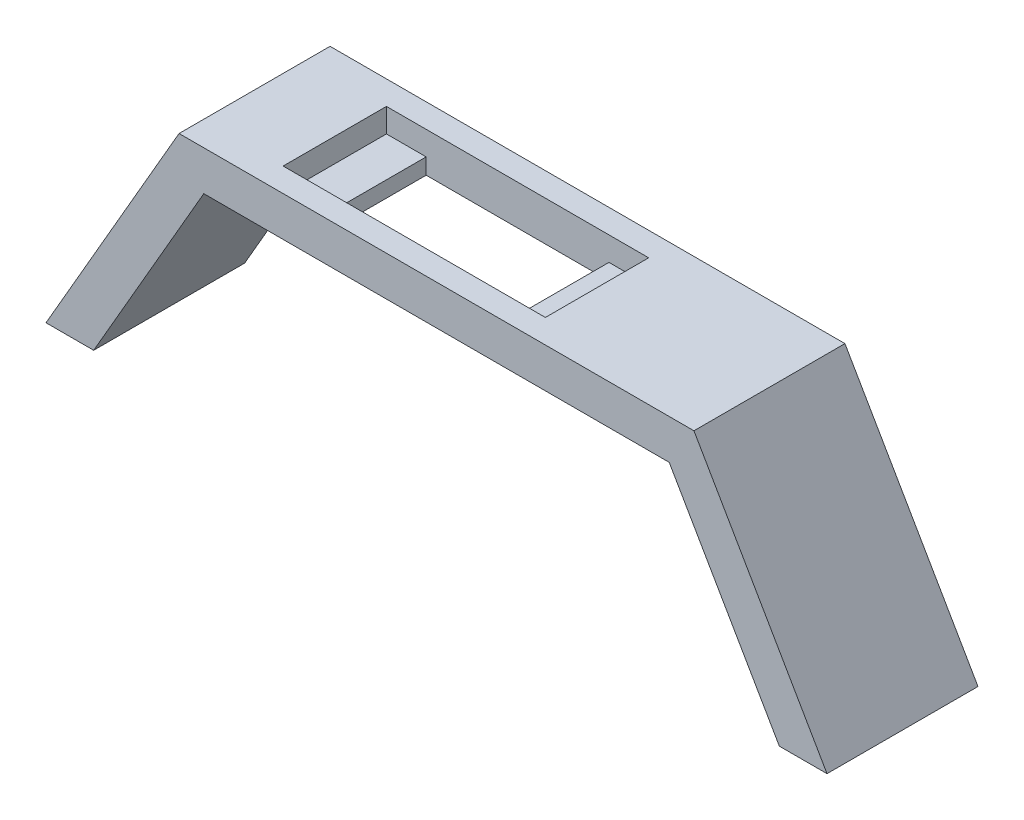
ISO-10303-21;
HEADER;
FILE_DESCRIPTION(('STEP AP214'),'2;1');
FILE_NAME('part.step','',(''),(''),'','','');
FILE_SCHEMA(('AUTOMOTIVE_DESIGN { 1 0 10303 214 1 1 1 1 }'));
ENDSEC;
DATA;
#1=APPLICATION_CONTEXT('core data for automotive mechanical design processes');
#2=APPLICATION_PROTOCOL_DEFINITION('international standard','automotive_design',2000,#1);
#3=PRODUCT_CONTEXT('',#1,'mechanical');
#4=PRODUCT('Part','Part','',(#3));
#5=PRODUCT_RELATED_PRODUCT_CATEGORY('part','',(#4));
#6=PRODUCT_DEFINITION_FORMATION('','',#4);
#7=PRODUCT_DEFINITION_CONTEXT('part definition',#1,'design');
#8=PRODUCT_DEFINITION('design','',#6,#7);
#9=PRODUCT_DEFINITION_SHAPE('','',#8);
#10=(LENGTH_UNIT() NAMED_UNIT(*) SI_UNIT(.MILLI.,.METRE.));
#11=(NAMED_UNIT(*) PLANE_ANGLE_UNIT() SI_UNIT($,.RADIAN.));
#12=(NAMED_UNIT(*) SI_UNIT($,.STERADIAN.) SOLID_ANGLE_UNIT());
#13=UNCERTAINTY_MEASURE_WITH_UNIT(LENGTH_MEASURE(1.E-05),#10,'distance_accuracy_value','');
#14=(GEOMETRIC_REPRESENTATION_CONTEXT(3) GLOBAL_UNCERTAINTY_ASSIGNED_CONTEXT((#13)) GLOBAL_UNIT_ASSIGNED_CONTEXT((#10,
#11,#12)) REPRESENTATION_CONTEXT('',''));
#15=CARTESIAN_POINT('',(0.,0.,0.));
#16=DIRECTION('',(0.,0.,1.));
#17=DIRECTION('',(1.,0.,0.));
#18=AXIS2_PLACEMENT_3D('',#15,#16,#17);
#19=CARTESIAN_POINT('',(0.,2.,0.));
#20=DIRECTION('',(0.,-1.,0.));
#21=DIRECTION('',(1.,0.,0.));
#22=AXIS2_PLACEMENT_3D('',#19,#20,#21);
#23=PLANE('',#22);
#24=DIRECTION('',(0.,0.,-1.));
#25=VECTOR('',#24,1.);
#26=CARTESIAN_POINT('',(5.7,2.,3.));
#27=LINE('',#26,#25);
#28=CARTESIAN_POINT('',(5.7,2.,16.));
#29=VERTEX_POINT('',#28);
#30=CARTESIAN_POINT('',(5.7,2.,3.));
#31=VERTEX_POINT('',#30);
#32=EDGE_CURVE('E162',#29,#31,#27,.T.);
#33=ORIENTED_EDGE('',*,*,#32,.F.);
#34=DIRECTION('',(1.,0.,0.));
#35=VECTOR('',#34,1.);
#36=CARTESIAN_POINT('',(10.7,2.00000000000001,16.));
#37=LINE('',#36,#35);
#38=CARTESIAN_POINT('',(10.7,2.00000000000001,16.));
#39=VERTEX_POINT('',#38);
#40=EDGE_CURVE('E194',#29,#39,#37,.T.);
#41=ORIENTED_EDGE('',*,*,#40,.T.);
#42=DIRECTION('',(0.,0.,-1.));
#43=VECTOR('',#42,1.);
#44=CARTESIAN_POINT('',(10.7,2.00000000000001,3.));
#45=LINE('',#44,#43);
#46=CARTESIAN_POINT('',(10.7,2.00000000000001,3.));
#47=VERTEX_POINT('',#46);
#48=EDGE_CURVE('E199',#39,#47,#45,.T.);
#49=ORIENTED_EDGE('',*,*,#48,.T.);
#50=DIRECTION('',(-1.,0.,0.));
#51=VECTOR('',#50,1.);
#52=CARTESIAN_POINT('',(10.7,2.00000000000001,3.));
#53=LINE('',#52,#51);
#54=EDGE_CURVE('E203',#47,#31,#53,.T.);
#55=ORIENTED_EDGE('',*,*,#54,.T.);
#56=EDGE_LOOP('',(#33,#41,#49,#55));
#57=FACE_BOUND('',#56,.T.);
#58=ADVANCED_FACE('F43',(#57),#23,.F.);
#59=DIRECTION('',(0.,0.,1.));
#60=VECTOR('',#59,1.);
#61=CARTESIAN_POINT('',(-17.3,2.,3.));
#62=LINE('',#61,#60);
#63=CARTESIAN_POINT('',(-17.3,2.,3.));
#64=VERTEX_POINT('',#63);
#65=CARTESIAN_POINT('',(-17.3,2.,16.));
#66=VERTEX_POINT('',#65);
#67=EDGE_CURVE('E166',#64,#66,#62,.T.);
#68=ORIENTED_EDGE('',*,*,#67,.F.);
#69=CARTESIAN_POINT('',(-22.3,2.,3.));
#70=VERTEX_POINT('',#69);
#71=EDGE_CURVE('E202',#64,#70,#53,.T.);
#72=ORIENTED_EDGE('',*,*,#71,.T.);
#73=DIRECTION('',(0.,0.,1.));
#74=VECTOR('',#73,1.);
#75=CARTESIAN_POINT('',(-22.3,2.,3.));
#76=LINE('',#75,#74);
#77=CARTESIAN_POINT('',(-22.3,2.,16.));
#78=VERTEX_POINT('',#77);
#79=EDGE_CURVE('E191',#70,#78,#76,.T.);
#80=ORIENTED_EDGE('',*,*,#79,.T.);
#81=EDGE_CURVE('E196',#78,#66,#37,.T.);
#82=ORIENTED_EDGE('',*,*,#81,.T.);
#83=EDGE_LOOP('',(#68,#72,#80,#82));
#84=FACE_BOUND('',#83,.T.);
#85=ADVANCED_FACE('F324',(#84),#23,.F.);
#86=CARTESIAN_POINT('',(-43.14,-24.,19.));
#87=DIRECTION('',(-0.866025403784445,0.499999999999989,0.));
#88=DIRECTION('',(-0.499999999999989,-0.866025403784445,0.));
#89=AXIS2_PLACEMENT_3D('',#86,#87,#88);
#90=PLANE('',#89);
#91=DIRECTION('',(0.499999999999989,0.866025403784445,0.));
#92=VECTOR('',#91,1.);
#93=CARTESIAN_POINT('',(-43.14,-24.,0.));
#94=LINE('',#93,#92);
#95=CARTESIAN_POINT('',(-43.14,-24.,0.));
#96=VERTEX_POINT('',#95);
#97=CARTESIAN_POINT('',(-29.2835935394492,2.81672040281602E-13,0.));
#98=VERTEX_POINT('',#97);
#99=EDGE_CURVE('E216',#96,#98,#94,.T.);
#100=ORIENTED_EDGE('',*,*,#99,.T.);
#101=DIRECTION('',(0.,0.,-1.));
#102=VECTOR('',#101,1.);
#103=CARTESIAN_POINT('',(-29.2835935394492,2.81672040281602E-13,19.));
#104=LINE('',#103,#102);
#105=CARTESIAN_POINT('',(-29.2835935394492,2.81672040281602E-13,19.));
#106=VERTEX_POINT('',#105);
#107=EDGE_CURVE('E11',#106,#98,#104,.T.);
#108=ORIENTED_EDGE('',*,*,#107,.F.);
#109=DIRECTION('',(0.499999999999989,0.866025403784445,0.));
#110=VECTOR('',#109,1.);
#111=CARTESIAN_POINT('',(-43.14,-24.,19.));
#112=LINE('',#111,#110);
#113=CARTESIAN_POINT('',(-43.14,-24.,19.));
#114=VERTEX_POINT('',#113);
#115=EDGE_CURVE('E223',#114,#106,#112,.T.);
#116=ORIENTED_EDGE('',*,*,#115,.F.);
#117=DIRECTION('',(0.,0.,-1.));
#118=VECTOR('',#117,1.);
#119=CARTESIAN_POINT('',(-43.14,-24.,19.));
#120=LINE('',#119,#118);
#121=EDGE_CURVE('E241',#114,#96,#120,.T.);
#122=ORIENTED_EDGE('',*,*,#121,.T.);
#123=EDGE_LOOP('',(#100,#108,#116,#122));
#124=FACE_BOUND('',#123,.T.);
#125=ADVANCED_FACE('F45',(#124),#90,.F.);
#126=CARTESIAN_POINT('',(-29.2835935394492,2.81672040281602E-13,19.));
#127=DIRECTION('',(0.,1.,0.));
#128=DIRECTION('',(-1.,0.,0.));
#129=AXIS2_PLACEMENT_3D('',#126,#127,#128);
#130=PLANE('',#129);
#131=DIRECTION('',(-1.,0.,0.));
#132=VECTOR('',#131,1.);
#133=CARTESIAN_POINT('',(-17.2999999999999,2.25514051876985E-13,16.));
#134=LINE('',#133,#132);
#135=CARTESIAN_POINT('',(5.7,1.70002900645727E-13,16.));
#136=VERTEX_POINT('',#135);
#137=CARTESIAN_POINT('',(-17.3,2.25514051876985E-13,16.));
#138=VERTEX_POINT('',#137);
#139=EDGE_CURVE('E180',#136,#138,#134,.T.);
#140=ORIENTED_EDGE('',*,*,#139,.F.);
#141=DIRECTION('',(0.,0.,1.));
#142=VECTOR('',#141,1.);
#143=CARTESIAN_POINT('',(5.7,1.14491749414469E-13,3.));
#144=LINE('',#143,#142);
#145=CARTESIAN_POINT('',(5.7,1.17020051753932E-13,3.));
#146=VERTEX_POINT('',#145);
#147=EDGE_CURVE('E159',#146,#136,#144,.T.);
#148=ORIENTED_EDGE('',*,*,#147,.F.);
#149=DIRECTION('',(1.,0.,0.));
#150=VECTOR('',#149,1.);
#151=CARTESIAN_POINT('',(-17.2999999999999,2.25514051876985E-13,3.));
#152=LINE('',#151,#150);
#153=CARTESIAN_POINT('',(-17.3,2.25143866414488E-13,3.));
#154=VERTEX_POINT('',#153);
#155=EDGE_CURVE('E169',#154,#146,#152,.T.);
#156=ORIENTED_EDGE('',*,*,#155,.F.);
#157=DIRECTION('',(0.,0.,-1.));
#158=VECTOR('',#157,1.);
#159=CARTESIAN_POINT('',(-17.3,2.25514051876985E-13,3.));
#160=LINE('',#159,#158);
#161=EDGE_CURVE('E63',#138,#154,#160,.T.);
#162=ORIENTED_EDGE('',*,*,#161,.F.);
#163=EDGE_LOOP('',(#140,#148,#156,#162));
#164=FACE_BOUND('',#163,.T.);
#165=DIRECTION('',(1.,0.,0.));
#166=VECTOR('',#165,1.);
#167=CARTESIAN_POINT('',(-29.2835935394492,2.81672040281602E-13,0.));
#168=LINE('',#167,#166);
#169=CARTESIAN_POINT('',(29.2835935394491,0.,0.));
#170=VERTEX_POINT('',#169);
#171=EDGE_CURVE('E244',#98,#170,#168,.T.);
#172=ORIENTED_EDGE('',*,*,#171,.T.);
#173=DIRECTION('',(0.,0.,-1.));
#174=VECTOR('',#173,1.);
#175=CARTESIAN_POINT('',(29.2835935394491,0.,19.));
#176=LINE('',#175,#174);
#177=CARTESIAN_POINT('',(29.2835935394491,0.,19.));
#178=VERTEX_POINT('',#177);
#179=EDGE_CURVE('E51',#178,#170,#176,.T.);
#180=ORIENTED_EDGE('',*,*,#179,.F.);
#181=DIRECTION('',(1.,0.,0.));
#182=VECTOR('',#181,1.);
#183=CARTESIAN_POINT('',(-29.2835935394492,2.81672040281602E-13,19.));
#184=LINE('',#183,#182);
#185=EDGE_CURVE('E226',#106,#178,#184,.T.);
#186=ORIENTED_EDGE('',*,*,#185,.F.);
#187=ORIENTED_EDGE('',*,*,#107,.T.);
#188=EDGE_LOOP('',(#172,#180,#186,#187));
#189=FACE_BOUND('',#188,.T.);
#190=ADVANCED_FACE('F177',(#164,#189),#130,.F.);
#191=CARTESIAN_POINT('',(29.2835935394491,0.,19.));
#192=DIRECTION('',(0.86602540378444,0.499999999999998,0.));
#193=DIRECTION('',(-0.499999999999998,0.86602540378444,0.));
#194=AXIS2_PLACEMENT_3D('',#191,#192,#193);
#195=PLANE('',#194);
#196=DIRECTION('',(0.499999999999998,-0.86602540378444,0.));
#197=VECTOR('',#196,1.);
#198=CARTESIAN_POINT('',(29.2835935394491,0.,0.));
#199=LINE('',#198,#197);
#200=CARTESIAN_POINT('',(43.14,-24.,0.));
#201=VERTEX_POINT('',#200);
#202=EDGE_CURVE('E246',#170,#201,#199,.T.);
#203=ORIENTED_EDGE('',*,*,#202,.T.);
#204=DIRECTION('',(0.,0.,-1.));
#205=VECTOR('',#204,1.);
#206=CARTESIAN_POINT('',(43.14,-24.,19.));
#207=LINE('',#206,#205);
#208=CARTESIAN_POINT('',(43.14,-24.,19.));
#209=VERTEX_POINT('',#208);
#210=EDGE_CURVE('E271',#209,#201,#207,.T.);
#211=ORIENTED_EDGE('',*,*,#210,.F.);
#212=DIRECTION('',(0.499999999999998,-0.86602540378444,0.));
#213=VECTOR('',#212,1.);
#214=CARTESIAN_POINT('',(29.2835935394491,0.,19.));
#215=LINE('',#214,#213);
#216=EDGE_CURVE('E229',#178,#209,#215,.T.);
#217=ORIENTED_EDGE('',*,*,#216,.F.);
#218=ORIENTED_EDGE('',*,*,#179,.T.);
#219=EDGE_LOOP('',(#203,#211,#217,#218));
#220=FACE_BOUND('',#219,.T.);
#221=ADVANCED_FACE('F278',(#220),#195,.F.);
#222=CARTESIAN_POINT('',(43.14,-24.,19.));
#223=DIRECTION('',(0.,1.,0.));
#224=DIRECTION('',(-1.,0.,0.));
#225=AXIS2_PLACEMENT_3D('',#222,#223,#224);
#226=PLANE('',#225);
#227=DIRECTION('',(1.,0.,0.));
#228=VECTOR('',#227,1.);
#229=CARTESIAN_POINT('',(43.14,-24.,0.));
#230=LINE('',#229,#228);
#231=CARTESIAN_POINT('',(49.14,-24.,0.));
#232=VERTEX_POINT('',#231);
#233=EDGE_CURVE('E248',#201,#232,#230,.T.);
#234=ORIENTED_EDGE('',*,*,#233,.T.);
#235=DIRECTION('',(0.,0.,-1.));
#236=VECTOR('',#235,1.);
#237=CARTESIAN_POINT('',(49.14,-24.,19.));
#238=LINE('',#237,#236);
#239=CARTESIAN_POINT('',(49.14,-24.,19.));
#240=VERTEX_POINT('',#239);
#241=EDGE_CURVE('E268',#240,#232,#238,.T.);
#242=ORIENTED_EDGE('',*,*,#241,.F.);
#243=DIRECTION('',(1.,0.,0.));
#244=VECTOR('',#243,1.);
#245=CARTESIAN_POINT('',(43.14,-24.,19.));
#246=LINE('',#245,#244);
#247=EDGE_CURVE('E231',#209,#240,#246,.T.);
#248=ORIENTED_EDGE('',*,*,#247,.F.);
#249=ORIENTED_EDGE('',*,*,#210,.T.);
#250=EDGE_LOOP('',(#234,#242,#248,#249));
#251=FACE_BOUND('',#250,.T.);
#252=ADVANCED_FACE('F288',(#251),#226,.F.);
#253=CARTESIAN_POINT('',(49.14,-24.,19.));
#254=DIRECTION('',(-0.86602540378444,-0.499999999999997,0.));
#255=DIRECTION('',(0.499999999999997,-0.86602540378444,0.));
#256=AXIS2_PLACEMENT_3D('',#253,#254,#255);
#257=PLANE('',#256);
#258=DIRECTION('',(-0.499999999999997,0.86602540378444,0.));
#259=VECTOR('',#258,1.);
#260=CARTESIAN_POINT('',(49.14,-24.,0.));
#261=LINE('',#260,#259);
#262=CARTESIAN_POINT('',(32.396842193501,5.00000000000001,0.));
#263=VERTEX_POINT('',#262);
#264=EDGE_CURVE('E250',#232,#263,#261,.T.);
#265=ORIENTED_EDGE('',*,*,#264,.T.);
#266=DIRECTION('',(0.,0.,-1.));
#267=VECTOR('',#266,1.);
#268=CARTESIAN_POINT('',(32.396842193501,5.00000000000001,19.));
#269=LINE('',#268,#267);
#270=CARTESIAN_POINT('',(32.396842193501,5.00000000000001,19.));
#271=VERTEX_POINT('',#270);
#272=EDGE_CURVE('E265',#271,#263,#269,.T.);
#273=ORIENTED_EDGE('',*,*,#272,.F.);
#274=DIRECTION('',(-0.499999999999997,0.86602540378444,0.));
#275=VECTOR('',#274,1.);
#276=CARTESIAN_POINT('',(49.14,-24.,19.));
#277=LINE('',#276,#275);
#278=EDGE_CURVE('E233',#240,#271,#277,.T.);
#279=ORIENTED_EDGE('',*,*,#278,.F.);
#280=ORIENTED_EDGE('',*,*,#241,.T.);
#281=EDGE_LOOP('',(#265,#273,#279,#280));
#282=FACE_BOUND('',#281,.T.);
#283=ADVANCED_FACE('F292',(#282),#257,.F.);
#284=CARTESIAN_POINT('',(32.396842193501,5.00000000000001,19.));
#285=DIRECTION('',(0.,-1.,0.));
#286=DIRECTION('',(1.,0.,0.));
#287=AXIS2_PLACEMENT_3D('',#284,#285,#286);
#288=PLANE('',#287);
#289=DIRECTION('',(1.,0.,0.));
#290=VECTOR('',#289,1.);
#291=CARTESIAN_POINT('',(10.7,5.00000000000001,16.));
#292=LINE('',#291,#290);
#293=CARTESIAN_POINT('',(-22.3,5.,16.));
#294=VERTEX_POINT('',#293);
#295=CARTESIAN_POINT('',(10.7,5.00000000000001,16.));
#296=VERTEX_POINT('',#295);
#297=EDGE_CURVE('E207',#294,#296,#292,.T.);
#298=ORIENTED_EDGE('',*,*,#297,.F.);
#299=DIRECTION('',(0.,0.,1.));
#300=VECTOR('',#299,1.);
#301=CARTESIAN_POINT('',(-22.3,5.,3.));
#302=LINE('',#301,#300);
#303=CARTESIAN_POINT('',(-22.3,5.,3.));
#304=VERTEX_POINT('',#303);
#305=EDGE_CURVE('E174',#304,#294,#302,.T.);
#306=ORIENTED_EDGE('',*,*,#305,.F.);
#307=DIRECTION('',(-1.,0.,0.));
#308=VECTOR('',#307,1.);
#309=CARTESIAN_POINT('',(10.7,5.00000000000001,3.));
#310=LINE('',#309,#308);
#311=CARTESIAN_POINT('',(10.7,5.00000000000001,3.));
#312=VERTEX_POINT('',#311);
#313=EDGE_CURVE('E195',#312,#304,#310,.T.);
#314=ORIENTED_EDGE('',*,*,#313,.F.);
#315=DIRECTION('',(0.,0.,-1.));
#316=VECTOR('',#315,1.);
#317=CARTESIAN_POINT('',(10.7,5.00000000000001,3.));
#318=LINE('',#317,#316);
#319=EDGE_CURVE('E210',#296,#312,#318,.T.);
#320=ORIENTED_EDGE('',*,*,#319,.F.);
#321=EDGE_LOOP('',(#298,#306,#314,#320));
#322=FACE_BOUND('',#321,.T.);
#323=DIRECTION('',(-1.,0.,0.));
#324=VECTOR('',#323,1.);
#325=CARTESIAN_POINT('',(32.396842193501,5.00000000000001,0.));
#326=LINE('',#325,#324);
#327=CARTESIAN_POINT('',(-32.396842193501,5.,0.));
#328=VERTEX_POINT('',#327);
#329=EDGE_CURVE('E252',#263,#328,#326,.T.);
#330=ORIENTED_EDGE('',*,*,#329,.T.);
#331=DIRECTION('',(0.,0.,-1.));
#332=VECTOR('',#331,1.);
#333=CARTESIAN_POINT('',(-32.396842193501,5.,19.));
#334=LINE('',#333,#332);
#335=CARTESIAN_POINT('',(-32.396842193501,5.,19.));
#336=VERTEX_POINT('',#335);
#337=EDGE_CURVE('E262',#336,#328,#334,.T.);
#338=ORIENTED_EDGE('',*,*,#337,.F.);
#339=DIRECTION('',(-1.,0.,0.));
#340=VECTOR('',#339,1.);
#341=CARTESIAN_POINT('',(32.396842193501,5.00000000000001,19.));
#342=LINE('',#341,#340);
#343=EDGE_CURVE('E235',#271,#336,#342,.T.);
#344=ORIENTED_EDGE('',*,*,#343,.F.);
#345=ORIENTED_EDGE('',*,*,#272,.T.);
#346=EDGE_LOOP('',(#330,#338,#344,#345));
#347=FACE_BOUND('',#346,.T.);
#348=ADVANCED_FACE('F312',(#322,#347),#288,.F.);
#349=CARTESIAN_POINT('',(-32.396842193501,5.,19.));
#350=DIRECTION('',(0.86602540378444,-0.499999999999998,0.));
#351=DIRECTION('',(0.499999999999998,0.86602540378444,0.));
#352=AXIS2_PLACEMENT_3D('',#349,#350,#351);
#353=PLANE('',#352);
#354=DIRECTION('',(-0.499999999999998,-0.86602540378444,0.));
#355=VECTOR('',#354,1.);
#356=CARTESIAN_POINT('',(-32.396842193501,5.,0.));
#357=LINE('',#356,#355);
#358=CARTESIAN_POINT('',(-49.14,-24.,0.));
#359=VERTEX_POINT('',#358);
#360=EDGE_CURVE('E254',#328,#359,#357,.T.);
#361=ORIENTED_EDGE('',*,*,#360,.T.);
#362=DIRECTION('',(0.,0.,-1.));
#363=VECTOR('',#362,1.);
#364=CARTESIAN_POINT('',(-49.14,-24.,19.));
#365=LINE('',#364,#363);
#366=CARTESIAN_POINT('',(-49.14,-24.,19.));
#367=VERTEX_POINT('',#366);
#368=EDGE_CURVE('E259',#367,#359,#365,.T.);
#369=ORIENTED_EDGE('',*,*,#368,.F.);
#370=DIRECTION('',(-0.499999999999998,-0.86602540378444,0.));
#371=VECTOR('',#370,1.);
#372=CARTESIAN_POINT('',(-32.396842193501,5.,19.));
#373=LINE('',#372,#371);
#374=EDGE_CURVE('E237',#336,#367,#373,.T.);
#375=ORIENTED_EDGE('',*,*,#374,.F.);
#376=ORIENTED_EDGE('',*,*,#337,.T.);
#377=EDGE_LOOP('',(#361,#369,#375,#376));
#378=FACE_BOUND('',#377,.T.);
#379=ADVANCED_FACE('F310',(#378),#353,.F.);
#380=CARTESIAN_POINT('',(-49.14,-24.,19.));
#381=DIRECTION('',(0.,1.,0.));
#382=DIRECTION('',(0.,0.,1.));
#383=AXIS2_PLACEMENT_3D('',#380,#381,#382);
#384=PLANE('',#383);
#385=DIRECTION('',(1.,0.,0.));
#386=VECTOR('',#385,1.);
#387=CARTESIAN_POINT('',(-49.14,-24.,0.));
#388=LINE('',#387,#386);
#389=EDGE_CURVE('E227',#359,#96,#388,.T.);
#390=ORIENTED_EDGE('',*,*,#389,.T.);
#391=ORIENTED_EDGE('',*,*,#121,.F.);
#392=DIRECTION('',(1.,0.,0.));
#393=VECTOR('',#392,1.);
#394=CARTESIAN_POINT('',(-49.14,-24.,19.));
#395=LINE('',#394,#393);
#396=EDGE_CURVE('E239',#367,#114,#395,.T.);
#397=ORIENTED_EDGE('',*,*,#396,.F.);
#398=ORIENTED_EDGE('',*,*,#368,.T.);
#399=EDGE_LOOP('',(#390,#391,#397,#398));
#400=FACE_BOUND('',#399,.T.);
#401=ADVANCED_FACE('F305',(#400),#384,.F.);
#402=CARTESIAN_POINT('',(0.,0.,19.));
#403=DIRECTION('',(0.,0.,-1.));
#404=DIRECTION('',(-1.,0.,0.));
#405=AXIS2_PLACEMENT_3D('',#402,#403,#404);
#406=PLANE('',#405);
#407=ORIENTED_EDGE('',*,*,#115,.T.);
#408=ORIENTED_EDGE('',*,*,#185,.T.);
#409=ORIENTED_EDGE('',*,*,#216,.T.);
#410=ORIENTED_EDGE('',*,*,#247,.T.);
#411=ORIENTED_EDGE('',*,*,#278,.T.);
#412=ORIENTED_EDGE('',*,*,#343,.T.);
#413=ORIENTED_EDGE('',*,*,#374,.T.);
#414=ORIENTED_EDGE('',*,*,#396,.T.);
#415=EDGE_LOOP('',(#407,#408,#409,#410,#411,#412,#413,#414));
#416=FACE_BOUND('',#415,.T.);
#417=ADVANCED_FACE('F296',(#416),#406,.F.);
#418=CARTESIAN_POINT('',(0.,0.,0.));
#419=DIRECTION('',(0.,0.,-1.));
#420=DIRECTION('',(-1.,0.,0.));
#421=AXIS2_PLACEMENT_3D('',#418,#419,#420);
#422=PLANE('',#421);
#423=ORIENTED_EDGE('',*,*,#99,.F.);
#424=ORIENTED_EDGE('',*,*,#389,.F.);
#425=ORIENTED_EDGE('',*,*,#360,.F.);
#426=ORIENTED_EDGE('',*,*,#329,.F.);
#427=ORIENTED_EDGE('',*,*,#264,.F.);
#428=ORIENTED_EDGE('',*,*,#233,.F.);
#429=ORIENTED_EDGE('',*,*,#202,.F.);
#430=ORIENTED_EDGE('',*,*,#171,.F.);
#431=EDGE_LOOP('',(#423,#424,#425,#426,#427,#428,#429,#430));
#432=FACE_BOUND('',#431,.T.);
#433=ADVANCED_FACE('F283',(#432),#422,.T.);
#434=CARTESIAN_POINT('',(-22.3,2.,3.));
#435=DIRECTION('',(-1.,0.,0.));
#436=DIRECTION('',(0.,0.,1.));
#437=AXIS2_PLACEMENT_3D('',#434,#435,#436);
#438=PLANE('',#437);
#439=ORIENTED_EDGE('',*,*,#305,.T.);
#440=DIRECTION('',(0.,1.,0.));
#441=VECTOR('',#440,1.);
#442=CARTESIAN_POINT('',(-22.3,2.,16.));
#443=LINE('',#442,#441);
#444=EDGE_CURVE('E205',#78,#294,#443,.T.);
#445=ORIENTED_EDGE('',*,*,#444,.F.);
#446=ORIENTED_EDGE('',*,*,#79,.F.);
#447=DIRECTION('',(0.,1.,0.));
#448=VECTOR('',#447,1.);
#449=CARTESIAN_POINT('',(-22.3,2.,3.));
#450=LINE('',#449,#448);
#451=EDGE_CURVE('E214',#70,#304,#450,.T.);
#452=ORIENTED_EDGE('',*,*,#451,.T.);
#453=EDGE_LOOP('',(#439,#445,#446,#452));
#454=FACE_BOUND('',#453,.T.);
#455=ADVANCED_FACE('F337',(#454),#438,.F.);
#456=CARTESIAN_POINT('',(10.7,2.00000000000001,3.));
#457=DIRECTION('',(0.,0.,-1.));
#458=DIRECTION('',(-1.,0.,0.));
#459=AXIS2_PLACEMENT_3D('',#456,#457,#458);
#460=PLANE('',#459);
#461=ORIENTED_EDGE('',*,*,#313,.T.);
#462=ORIENTED_EDGE('',*,*,#451,.F.);
#463=ORIENTED_EDGE('',*,*,#71,.F.);
#464=DIRECTION('',(0.,1.,0.));
#465=VECTOR('',#464,1.);
#466=CARTESIAN_POINT('',(-17.3,-24.001,3.));
#467=LINE('',#466,#465);
#468=EDGE_CURVE('E58',#154,#64,#467,.T.);
#469=ORIENTED_EDGE('',*,*,#468,.F.);
#470=ORIENTED_EDGE('',*,*,#155,.T.);
#471=DIRECTION('',(0.,1.,0.));
#472=VECTOR('',#471,1.);
#473=CARTESIAN_POINT('',(5.7,-24.001,3.));
#474=LINE('',#473,#472);
#475=EDGE_CURVE('E155',#146,#31,#474,.T.);
#476=ORIENTED_EDGE('',*,*,#475,.T.);
#477=ORIENTED_EDGE('',*,*,#54,.F.);
#478=DIRECTION('',(0.,1.,0.));
#479=VECTOR('',#478,1.);
#480=CARTESIAN_POINT('',(10.7,2.00000000000001,3.));
#481=LINE('',#480,#479);
#482=EDGE_CURVE('E217',#47,#312,#481,.T.);
#483=ORIENTED_EDGE('',*,*,#482,.T.);
#484=EDGE_LOOP('',(#461,#462,#463,#469,#470,#476,#477,#483));
#485=FACE_BOUND('',#484,.T.);
#486=ADVANCED_FACE('F171',(#485),#460,.F.);
#487=CARTESIAN_POINT('',(10.7,2.00000000000001,3.));
#488=DIRECTION('',(1.,0.,0.));
#489=DIRECTION('',(0.,1.,0.));
#490=AXIS2_PLACEMENT_3D('',#487,#488,#489);
#491=PLANE('',#490);
#492=ORIENTED_EDGE('',*,*,#319,.T.);
#493=ORIENTED_EDGE('',*,*,#482,.F.);
#494=ORIENTED_EDGE('',*,*,#48,.F.);
#495=DIRECTION('',(0.,1.,0.));
#496=VECTOR('',#495,1.);
#497=CARTESIAN_POINT('',(10.7,2.00000000000001,16.));
#498=LINE('',#497,#496);
#499=EDGE_CURVE('E219',#39,#296,#498,.T.);
#500=ORIENTED_EDGE('',*,*,#499,.T.);
#501=EDGE_LOOP('',(#492,#493,#494,#500));
#502=FACE_BOUND('',#501,.T.);
#503=ADVANCED_FACE('F336',(#502),#491,.F.);
#504=CARTESIAN_POINT('',(10.7,2.00000000000001,16.));
#505=DIRECTION('',(0.,0.,1.));
#506=DIRECTION('',(1.,0.,0.));
#507=AXIS2_PLACEMENT_3D('',#504,#505,#506);
#508=PLANE('',#507);
#509=ORIENTED_EDGE('',*,*,#297,.T.);
#510=ORIENTED_EDGE('',*,*,#499,.F.);
#511=ORIENTED_EDGE('',*,*,#40,.F.);
#512=DIRECTION('',(0.,1.,0.));
#513=VECTOR('',#512,1.);
#514=CARTESIAN_POINT('',(5.7,-24.001,16.));
#515=LINE('',#514,#513);
#516=EDGE_CURVE('E175',#136,#29,#515,.T.);
#517=ORIENTED_EDGE('',*,*,#516,.F.);
#518=ORIENTED_EDGE('',*,*,#139,.T.);
#519=DIRECTION('',(0.,1.,0.));
#520=VECTOR('',#519,1.);
#521=CARTESIAN_POINT('',(-17.3,-24.001,16.));
#522=LINE('',#521,#520);
#523=EDGE_CURVE('E188',#138,#66,#522,.T.);
#524=ORIENTED_EDGE('',*,*,#523,.T.);
#525=ORIENTED_EDGE('',*,*,#81,.F.);
#526=ORIENTED_EDGE('',*,*,#444,.T.);
#527=EDGE_LOOP('',(#509,#510,#511,#517,#518,#524,#525,#526));
#528=FACE_BOUND('',#527,.T.);
#529=ADVANCED_FACE('F340',(#528),#508,.F.);
#530=CARTESIAN_POINT('',(5.7,-24.001,3.));
#531=DIRECTION('',(1.,0.,0.));
#532=DIRECTION('',(0.,1.,0.));
#533=AXIS2_PLACEMENT_3D('',#530,#531,#532);
#534=PLANE('',#533);
#535=ORIENTED_EDGE('',*,*,#147,.T.);
#536=ORIENTED_EDGE('',*,*,#516,.T.);
#537=ORIENTED_EDGE('',*,*,#32,.T.);
#538=ORIENTED_EDGE('',*,*,#475,.F.);
#539=EDGE_LOOP('',(#535,#536,#537,#538));
#540=FACE_BOUND('',#539,.T.);
#541=ADVANCED_FACE('F157',(#540),#534,.F.);
#542=CARTESIAN_POINT('',(-17.3,-24.001,3.));
#543=DIRECTION('',(-1.,0.,0.));
#544=DIRECTION('',(0.,0.,1.));
#545=AXIS2_PLACEMENT_3D('',#542,#543,#544);
#546=PLANE('',#545);
#547=ORIENTED_EDGE('',*,*,#161,.T.);
#548=ORIENTED_EDGE('',*,*,#468,.T.);
#549=ORIENTED_EDGE('',*,*,#67,.T.);
#550=ORIENTED_EDGE('',*,*,#523,.F.);
#551=EDGE_LOOP('',(#547,#548,#549,#550));
#552=FACE_BOUND('',#551,.T.);
#553=ADVANCED_FACE('F387',(#552),#546,.F.);
#554=CLOSED_SHELL('',(#58,#85,#125,#190,#221,#252,#283,#348,#379,#401,#417,#433,#455,#486,#503,
#529,#541,#553));
#555=MANIFOLD_SOLID_BREP('B2',#554);
#556=ADVANCED_BREP_SHAPE_REPRESENTATION('',(#18,#555),#14);
#557=SHAPE_DEFINITION_REPRESENTATION(#9,#556);
ENDSEC;
END-ISO-10303-21;
